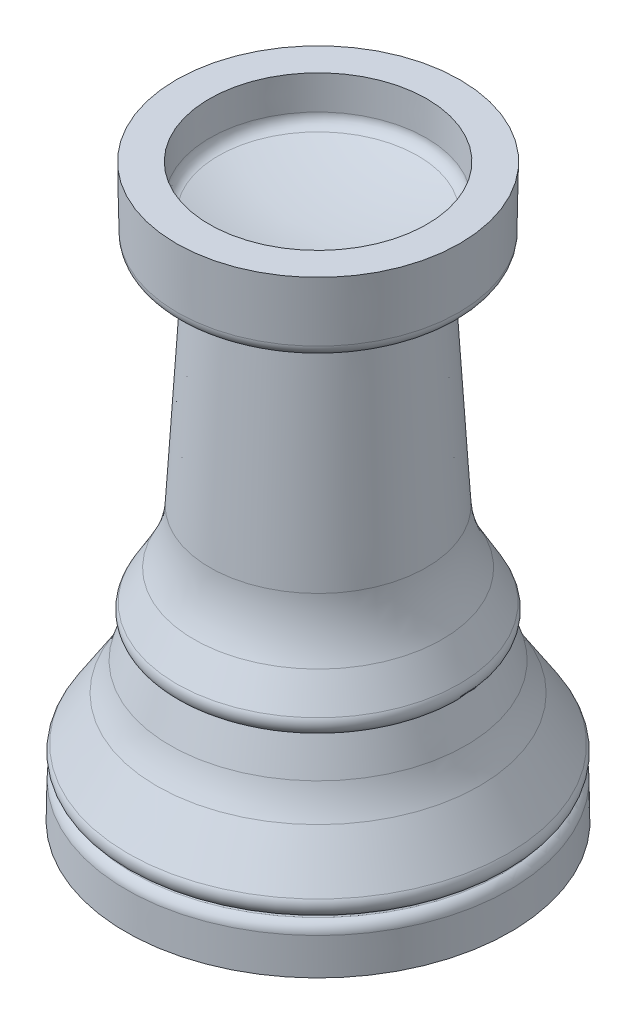
ISO-10303-21;
HEADER;
FILE_DESCRIPTION(('STEP AP214'),'2;1');
FILE_NAME('part.step','',(''),(''),'','','');
FILE_SCHEMA(('AUTOMOTIVE_DESIGN { 1 0 10303 214 1 1 1 1 }'));
ENDSEC;
DATA;
#1=APPLICATION_CONTEXT('core data for automotive mechanical design processes');
#2=APPLICATION_PROTOCOL_DEFINITION('international standard','automotive_design',2000,#1);
#3=PRODUCT_CONTEXT('',#1,'mechanical');
#4=PRODUCT('Part','Part','',(#3));
#5=PRODUCT_RELATED_PRODUCT_CATEGORY('part','',(#4));
#6=PRODUCT_DEFINITION_FORMATION('','',#4);
#7=PRODUCT_DEFINITION_CONTEXT('part definition',#1,'design');
#8=PRODUCT_DEFINITION('design','',#6,#7);
#9=PRODUCT_DEFINITION_SHAPE('','',#8);
#10=(LENGTH_UNIT() NAMED_UNIT(*) SI_UNIT(.MILLI.,.METRE.));
#11=(NAMED_UNIT(*) PLANE_ANGLE_UNIT() SI_UNIT($,.RADIAN.));
#12=(NAMED_UNIT(*) SI_UNIT($,.STERADIAN.) SOLID_ANGLE_UNIT());
#13=UNCERTAINTY_MEASURE_WITH_UNIT(LENGTH_MEASURE(1.E-05),#10,'distance_accuracy_value','');
#14=(GEOMETRIC_REPRESENTATION_CONTEXT(3) GLOBAL_UNCERTAINTY_ASSIGNED_CONTEXT((#13)) GLOBAL_UNIT_ASSIGNED_CONTEXT((#10,
#11,#12)) REPRESENTATION_CONTEXT('',''));
#15=CARTESIAN_POINT('',(0.,0.,0.));
#16=DIRECTION('',(0.,0.,1.));
#17=DIRECTION('',(1.,0.,0.));
#18=AXIS2_PLACEMENT_3D('',#15,#16,#17);
#19=CARTESIAN_POINT('',(119.157061,169.901604,0.));
#20=DIRECTION('',(0.,-1.,0.));
#21=DIRECTION('',(0.,0.,-1.));
#22=AXIS2_PLACEMENT_3D('',#19,#20,#21);
#23=TOROIDAL_SURFACE('',#22,8.00104199999999,1.00000051735934);
#24=CARTESIAN_POINT('',(119.157061,169.884151,0.));
#25=DIRECTION('',(0.,-1.,0.));
#26=DIRECTION('',(0.,0.,-1.));
#27=AXIS2_PLACEMENT_3D('',#24,#25,#26);
#28=CIRCLE('',#27,9.00089);
#29=CARTESIAN_POINT('',(119.157061,169.884151,-9.00089));
#30=VERTEX_POINT('',#29);
#31=EDGE_CURVE('E10',#30,#30,#28,.T.);
#32=ORIENTED_EDGE('',*,*,#31,.F.);
#33=EDGE_LOOP('',(#32));
#34=FACE_BOUND('',#33,.T.);
#35=CARTESIAN_POINT('',(119.157061,168.947626,0.));
#36=DIRECTION('',(0.,-1.,0.));
#37=DIRECTION('',(0.,0.,-1.));
#38=AXIS2_PLACEMENT_3D('',#35,#36,#37);
#39=CIRCLE('',#38,8.30092100000002);
#40=CARTESIAN_POINT('',(119.157061,168.947626,-8.30092100000002));
#41=VERTEX_POINT('',#40);
#42=EDGE_CURVE('E101',#41,#41,#39,.T.);
#43=ORIENTED_EDGE('',*,*,#42,.T.);
#44=EDGE_LOOP('',(#43));
#45=FACE_BOUND('',#44,.T.);
#46=ADVANCED_FACE('F28',(#34,#45),#23,.F.);
#47=CARTESIAN_POINT('',(119.157061,169.884151,0.));
#48=DIRECTION('',(0.,1.,0.));
#49=DIRECTION('',(0.,0.,1.));
#50=AXIS2_PLACEMENT_3D('',#47,#48,#49);
#51=CONICAL_SURFACE('',#50,9.00089,0.0174535102828913);
#52=CARTESIAN_POINT('',(119.157061,172.673679,0.));
#53=DIRECTION('',(0.,-1.,0.));
#54=DIRECTION('',(0.,0.,-1.));
#55=AXIS2_PLACEMENT_3D('',#52,#53,#54);
#56=CIRCLE('',#55,9.049582);
#57=CARTESIAN_POINT('',(119.157061,172.673679,-9.049582));
#58=VERTEX_POINT('',#57);
#59=EDGE_CURVE('E34',#58,#58,#56,.T.);
#60=ORIENTED_EDGE('',*,*,#59,.F.);
#61=EDGE_LOOP('',(#60));
#62=FACE_BOUND('',#61,.T.);
#63=ORIENTED_EDGE('',*,*,#31,.T.);
#64=EDGE_LOOP('',(#63));
#65=FACE_BOUND('',#64,.T.);
#66=ADVANCED_FACE('F117',(#62,#65),#51,.F.);
#67=CARTESIAN_POINT('',(107.357061,172.673679,0.));
#68=DIRECTION('',(0.,-1.,0.));
#69=DIRECTION('',(0.,0.,-1.));
#70=AXIS2_PLACEMENT_3D('',#67,#68,#69);
#71=PLANE('',#70);
#72=CARTESIAN_POINT('',(119.157061,172.673679,0.));
#73=DIRECTION('',(0.,-1.,0.));
#74=DIRECTION('',(0.,0.,-1.));
#75=AXIS2_PLACEMENT_3D('',#72,#73,#74);
#76=CIRCLE('',#75,11.8);
#77=CARTESIAN_POINT('',(119.157061,172.673679,-11.8));
#78=VERTEX_POINT('',#77);
#79=EDGE_CURVE('E38',#78,#78,#76,.T.);
#80=ORIENTED_EDGE('',*,*,#79,.F.);
#81=EDGE_LOOP('',(#80));
#82=FACE_BOUND('',#81,.T.);
#83=ORIENTED_EDGE('',*,*,#59,.T.);
#84=EDGE_LOOP('',(#83));
#85=FACE_BOUND('',#84,.T.);
#86=ADVANCED_FACE('F122',(#82,#85),#71,.F.);
#87=CARTESIAN_POINT('',(119.157061,172.673679,0.));
#88=DIRECTION('',(0.,1.,0.));
#89=DIRECTION('',(0.,0.,1.));
#90=AXIS2_PLACEMENT_3D('',#87,#88,#89);
#91=CONICAL_SURFACE('',#90,11.8,0.0174532306972353);
#92=CARTESIAN_POINT('',(119.157061,167.656225994025,0.));
#93=DIRECTION('',(0.,-1.,0.));
#94=DIRECTION('',(0.,0.,-1.));
#95=AXIS2_PLACEMENT_3D('',#92,#93,#94);
#96=CIRCLE('',#95,11.7124203422935);
#97=CARTESIAN_POINT('',(119.157061,167.656225994025,-11.7124203422935));
#98=VERTEX_POINT('',#97);
#99=EDGE_CURVE('E42',#98,#98,#96,.T.);
#100=ORIENTED_EDGE('',*,*,#99,.F.);
#101=EDGE_LOOP('',(#100));
#102=FACE_BOUND('',#101,.T.);
#103=ORIENTED_EDGE('',*,*,#79,.T.);
#104=EDGE_LOOP('',(#103));
#105=FACE_BOUND('',#104,.T.);
#106=ADVANCED_FACE('F127',(#102,#105),#91,.T.);
#107=CARTESIAN_POINT('',(119.157061,167.673679,0.));
#108=DIRECTION('',(0.,-1.,0.));
#109=DIRECTION('',(0.,0.,-1.));
#110=AXIS2_PLACEMENT_3D('',#107,#108,#109);
#111=TOROIDAL_SURFACE('',#110,10.712573,0.999999657654382);
#112=CARTESIAN_POINT('',(119.157061,166.673679,0.));
#113=DIRECTION('',(0.,-1.,0.));
#114=DIRECTION('',(0.,0.,-1.));
#115=AXIS2_PLACEMENT_3D('',#112,#113,#114);
#116=CIRCLE('',#115,10.712573);
#117=CARTESIAN_POINT('',(119.157061,166.673679,-10.712573));
#118=VERTEX_POINT('',#117);
#119=EDGE_CURVE('E47',#118,#118,#116,.T.);
#120=ORIENTED_EDGE('',*,*,#119,.F.);
#121=EDGE_LOOP('',(#120));
#122=FACE_BOUND('',#121,.T.);
#123=ORIENTED_EDGE('',*,*,#99,.T.);
#124=EDGE_LOOP('',(#123));
#125=FACE_BOUND('',#124,.T.);
#126=ADVANCED_FACE('F133',(#122,#125),#111,.T.);
#127=CARTESIAN_POINT('',(108.444488,166.673679,0.));
#128=DIRECTION('',(0.,1.,0.));
#129=DIRECTION('',(0.,0.,1.));
#130=AXIS2_PLACEMENT_3D('',#127,#128,#129);
#131=PLANE('',#130);
#132=CARTESIAN_POINT('',(119.157061,166.673679,0.));
#133=DIRECTION('',(0.,-1.,0.));
#134=DIRECTION('',(0.,0.,-1.));
#135=AXIS2_PLACEMENT_3D('',#132,#133,#134);
#136=CIRCLE('',#135,9.09999999999998);
#137=CARTESIAN_POINT('',(119.157061,166.673679,-9.09999999999998));
#138=VERTEX_POINT('',#137);
#139=EDGE_CURVE('E50',#138,#138,#136,.T.);
#140=ORIENTED_EDGE('',*,*,#139,.F.);
#141=EDGE_LOOP('',(#140));
#142=FACE_BOUND('',#141,.T.);
#143=ORIENTED_EDGE('',*,*,#119,.T.);
#144=EDGE_LOOP('',(#143));
#145=FACE_BOUND('',#144,.T.);
#146=ADVANCED_FACE('F137',(#142,#145),#131,.F.);
#147=CARTESIAN_POINT('',(119.157061,166.173679,0.));
#148=DIRECTION('',(0.,-1.,0.));
#149=DIRECTION('',(0.,0.,-1.));
#150=AXIS2_PLACEMENT_3D('',#147,#148,#149);
#151=TOROIDAL_SURFACE('',#150,9.09999999999998,0.5);
#152=CARTESIAN_POINT('',(119.157061,166.173679,0.));
#153=DIRECTION('',(0.,-1.,0.));
#154=DIRECTION('',(0.,0.,-1.));
#155=AXIS2_PLACEMENT_3D('',#152,#153,#154);
#156=CIRCLE('',#155,8.59999999999998);
#157=CARTESIAN_POINT('',(119.157061,166.173679,-8.59999999999998));
#158=VERTEX_POINT('',#157);
#159=EDGE_CURVE('E53',#158,#158,#156,.T.);
#160=ORIENTED_EDGE('',*,*,#159,.F.);
#161=EDGE_LOOP('',(#160));
#162=FACE_BOUND('',#161,.T.);
#163=ORIENTED_EDGE('',*,*,#139,.T.);
#164=EDGE_LOOP('',(#163));
#165=FACE_BOUND('',#164,.T.);
#166=ADVANCED_FACE('F141',(#162,#165),#151,.F.);
#167=CARTESIAN_POINT('',(119.157061,122.798679,0.));
#168=DIRECTION('',(0.,-1.,0.));
#169=DIRECTION('',(0.,0.,-1.));
#170=AXIS2_PLACEMENT_3D('',#167,#168,#169);
#171=CYLINDRICAL_SURFACE('',#170,8.59999999999998);
#172=CARTESIAN_POINT('',(119.157061,165.773679,0.));
#173=DIRECTION('',(0.,-1.,0.));
#174=DIRECTION('',(0.,0.,-1.));
#175=AXIS2_PLACEMENT_3D('',#172,#173,#174);
#176=CIRCLE('',#175,8.59999999999998);
#177=CARTESIAN_POINT('',(119.157061,165.773679,-8.59999999999998));
#178=VERTEX_POINT('',#177);
#179=EDGE_CURVE('E56',#178,#178,#176,.T.);
#180=ORIENTED_EDGE('',*,*,#179,.F.);
#181=EDGE_LOOP('',(#180));
#182=FACE_BOUND('',#181,.T.);
#183=ORIENTED_EDGE('',*,*,#159,.T.);
#184=EDGE_LOOP('',(#183));
#185=FACE_BOUND('',#184,.T.);
#186=ADVANCED_FACE('F145',(#182,#185),#171,.T.);
#187=CARTESIAN_POINT('',(119.157061,165.773679,0.));
#188=DIRECTION('',(0.,-1.,0.));
#189=DIRECTION('',(0.,0.,-1.));
#190=AXIS2_PLACEMENT_3D('',#187,#188,#189);
#191=TOROIDAL_SURFACE('',#190,7.99999999999999,0.599999999999989);
#192=CARTESIAN_POINT('',(119.157061,165.173679,0.));
#193=DIRECTION('',(0.,-1.,0.));
#194=DIRECTION('',(0.,0.,-1.));
#195=AXIS2_PLACEMENT_3D('',#192,#193,#194);
#196=CIRCLE('',#195,7.99999999999999);
#197=CARTESIAN_POINT('',(119.157061,165.173679,-7.99999999999999));
#198=VERTEX_POINT('',#197);
#199=EDGE_CURVE('E59',#198,#198,#196,.T.);
#200=ORIENTED_EDGE('',*,*,#199,.F.);
#201=EDGE_LOOP('',(#200));
#202=FACE_BOUND('',#201,.T.);
#203=ORIENTED_EDGE('',*,*,#179,.T.);
#204=EDGE_LOOP('',(#203));
#205=FACE_BOUND('',#204,.T.);
#206=ADVANCED_FACE('F149',(#202,#205),#191,.T.);
#207=CARTESIAN_POINT('',(119.157061,165.173679,0.));
#208=DIRECTION('',(0.,-1.,0.));
#209=DIRECTION('',(0.,0.,-1.));
#210=AXIS2_PLACEMENT_3D('',#207,#208,#209);
#211=CONICAL_SURFACE('',#210,7.99999999999999,0.0579287977524582);
#212=CARTESIAN_POINT('',(119.157061,147.923679001514,0.));
#213=DIRECTION('',(0.,-1.,0.));
#214=DIRECTION('',(0.,0.,-1.));
#215=AXIS2_PLACEMENT_3D('',#212,#213,#214);
#216=CIRCLE('',#215,9.00039103083482);
#217=CARTESIAN_POINT('',(119.157061,147.923679001514,-9.00039103083482));
#218=VERTEX_POINT('',#217);
#219=EDGE_CURVE('E62',#218,#218,#216,.T.);
#220=ORIENTED_EDGE('',*,*,#219,.F.);
#221=EDGE_LOOP('',(#220));
#222=FACE_BOUND('',#221,.T.);
#223=ORIENTED_EDGE('',*,*,#199,.T.);
#224=EDGE_LOOP('',(#223));
#225=FACE_BOUND('',#224,.T.);
#226=ADVANCED_FACE('F153',(#222,#225),#211,.T.);
#227=CARTESIAN_POINT('',(119.157061,148.414245,0.));
#228=DIRECTION('',(0.,-1.,0.));
#229=DIRECTION('',(0.,0.,-1.));
#230=AXIS2_PLACEMENT_3D('',#227,#228,#229);
#231=TOROIDAL_SURFACE('',#230,18.988351,9.99999996722579);
#232=CARTESIAN_POINT('',(119.157061,143.414245,0.));
#233=DIRECTION('',(0.,-1.,0.));
#234=DIRECTION('',(0.,0.,-1.));
#235=AXIS2_PLACEMENT_3D('',#232,#233,#234);
#236=CIRCLE('',#235,10.328097);
#237=CARTESIAN_POINT('',(119.157061,143.414245,-10.328097));
#238=VERTEX_POINT('',#237);
#239=EDGE_CURVE('E65',#238,#238,#236,.T.);
#240=ORIENTED_EDGE('',*,*,#239,.F.);
#241=EDGE_LOOP('',(#240));
#242=FACE_BOUND('',#241,.T.);
#243=ORIENTED_EDGE('',*,*,#219,.T.);
#244=EDGE_LOOP('',(#243));
#245=FACE_BOUND('',#244,.T.);
#246=ADVANCED_FACE('F157',(#242,#245),#231,.F.);
#247=CARTESIAN_POINT('',(119.157061,143.414245,0.));
#248=DIRECTION('',(0.,-1.,0.));
#249=DIRECTION('',(0.,0.,-1.));
#250=AXIS2_PLACEMENT_3D('',#247,#248,#249);
#251=CONICAL_SURFACE('',#250,10.328097,0.523598790494148);
#252=CARTESIAN_POINT('',(119.157061,140.923679,0.));
#253=DIRECTION('',(0.,-1.,0.));
#254=DIRECTION('',(0.,0.,-1.));
#255=AXIS2_PLACEMENT_3D('',#252,#253,#254);
#256=CIRCLE('',#255,11.766026);
#257=CARTESIAN_POINT('',(119.157061,140.923679,-11.766026));
#258=VERTEX_POINT('',#257);
#259=EDGE_CURVE('E68',#258,#258,#256,.T.);
#260=ORIENTED_EDGE('',*,*,#259,.F.);
#261=EDGE_LOOP('',(#260));
#262=FACE_BOUND('',#261,.T.);
#263=ORIENTED_EDGE('',*,*,#239,.T.);
#264=EDGE_LOOP('',(#263));
#265=FACE_BOUND('',#264,.T.);
#266=ADVANCED_FACE('F161',(#262,#265),#251,.T.);
#267=CARTESIAN_POINT('',(119.157061,140.423679,0.));
#268=DIRECTION('',(0.,-1.,0.));
#269=DIRECTION('',(0.,0.,-1.));
#270=AXIS2_PLACEMENT_3D('',#267,#268,#269);
#271=TOROIDAL_SURFACE('',#270,10.9,1.00000051633786);
#272=CARTESIAN_POINT('',(119.157061,139.557653,0.));
#273=DIRECTION('',(0.,-1.,0.));
#274=DIRECTION('',(0.,0.,-1.));
#275=AXIS2_PLACEMENT_3D('',#272,#273,#274);
#276=CIRCLE('',#275,11.4);
#277=CARTESIAN_POINT('',(119.157061,139.557653,-11.4));
#278=VERTEX_POINT('',#277);
#279=EDGE_CURVE('E71',#278,#278,#276,.T.);
#280=ORIENTED_EDGE('',*,*,#279,.F.);
#281=EDGE_LOOP('',(#280));
#282=FACE_BOUND('',#281,.T.);
#283=ORIENTED_EDGE('',*,*,#259,.T.);
#284=EDGE_LOOP('',(#283));
#285=FACE_BOUND('',#284,.T.);
#286=ADVANCED_FACE('F165',(#282,#285),#271,.T.);
#287=CARTESIAN_POINT('',(119.157061,139.557653,0.));
#288=DIRECTION('',(0.,-1.,0.));
#289=DIRECTION('',(0.,0.,-1.));
#290=AXIS2_PLACEMENT_3D('',#287,#288,#289);
#291=CONICAL_SURFACE('',#290,11.4,0.311374627497677);
#292=CARTESIAN_POINT('',(119.157061,136.756310005858,0.));
#293=DIRECTION('',(0.,-1.,0.));
#294=DIRECTION('',(0.,0.,-1.));
#295=AXIS2_PLACEMENT_3D('',#292,#293,#294);
#296=CIRCLE('',#295,12.3015950181999);
#297=CARTESIAN_POINT('',(119.157061,136.756310005858,-12.3015950181999));
#298=VERTEX_POINT('',#297);
#299=EDGE_CURVE('E74',#298,#298,#296,.T.);
#300=ORIENTED_EDGE('',*,*,#299,.F.);
#301=EDGE_LOOP('',(#300));
#302=FACE_BOUND('',#301,.T.);
#303=ORIENTED_EDGE('',*,*,#279,.T.);
#304=EDGE_LOOP('',(#303));
#305=FACE_BOUND('',#304,.T.);
#306=ADVANCED_FACE('F169',(#302,#305),#291,.T.);
#307=CARTESIAN_POINT('',(119.157061,139.819981,0.));
#308=DIRECTION('',(0.,-1.,0.));
#309=DIRECTION('',(0.,0.,-1.));
#310=AXIS2_PLACEMENT_3D('',#307,#308,#309);
#311=TOROIDAL_SURFACE('',#310,21.820729,9.99999958619054);
#312=CARTESIAN_POINT('',(119.157061,134.396969238102,0.));
#313=DIRECTION('',(0.,-1.,0.));
#314=DIRECTION('',(0.,0.,-1.));
#315=AXIS2_PLACEMENT_3D('',#312,#313,#314);
#316=CIRCLE('',#315,13.4188878463158);
#317=CARTESIAN_POINT('',(119.157061,134.396969238102,-13.4188878463158));
#318=VERTEX_POINT('',#317);
#319=EDGE_CURVE('E77',#318,#318,#316,.T.);
#320=ORIENTED_EDGE('',*,*,#319,.F.);
#321=EDGE_LOOP('',(#320));
#322=FACE_BOUND('',#321,.T.);
#323=ORIENTED_EDGE('',*,*,#299,.T.);
#324=EDGE_LOOP('',(#323));
#325=FACE_BOUND('',#324,.T.);
#326=ADVANCED_FACE('F173',(#322,#325),#311,.F.);
#327=CARTESIAN_POINT('',(119.157061,134.396969238102,0.));
#328=DIRECTION('',(0.,-1.,0.));
#329=DIRECTION('',(0.,0.,-1.));
#330=AXIS2_PLACEMENT_3D('',#327,#328,#329);
#331=CONICAL_SURFACE('',#330,13.4188878463158,0.573173663652216);
#332=CARTESIAN_POINT('',(119.157061,130.715980269847,0.));
#333=DIRECTION('',(0.,-1.,0.));
#334=DIRECTION('',(0.,0.,-1.));
#335=AXIS2_PLACEMENT_3D('',#332,#333,#334);
#336=CIRCLE('',#335,15.7948014180718);
#337=CARTESIAN_POINT('',(119.157061,130.715980269847,-15.7948014180718));
#338=VERTEX_POINT('',#337);
#339=EDGE_CURVE('E80',#338,#338,#336,.T.);
#340=ORIENTED_EDGE('',*,*,#339,.F.);
#341=EDGE_LOOP('',(#340));
#342=FACE_BOUND('',#341,.T.);
#343=ORIENTED_EDGE('',*,*,#319,.T.);
#344=EDGE_LOOP('',(#343));
#345=FACE_BOUND('',#344,.T.);
#346=ADVANCED_FACE('F177',(#342,#345),#331,.T.);
#347=CARTESIAN_POINT('',(119.157061,130.173679,0.));
#348=DIRECTION('',(0.,-1.,0.));
#349=DIRECTION('',(0.,0.,-1.));
#350=AXIS2_PLACEMENT_3D('',#347,#348,#349);
#351=TOROIDAL_SURFACE('',#350,14.954617,1.00000026182392);
#352=CARTESIAN_POINT('',(119.157061,129.263101503594,0.));
#353=DIRECTION('',(0.,-1.,0.));
#354=DIRECTION('',(0.,0.,-1.));
#355=AXIS2_PLACEMENT_3D('',#352,#353,#354);
#356=CIRCLE('',#355,15.3679572253337);
#357=CARTESIAN_POINT('',(119.157061,129.263101503594,-15.3679572253337));
#358=VERTEX_POINT('',#357);
#359=EDGE_CURVE('E83',#358,#358,#356,.T.);
#360=ORIENTED_EDGE('',*,*,#359,.F.);
#361=EDGE_LOOP('',(#360));
#362=FACE_BOUND('',#361,.T.);
#363=ORIENTED_EDGE('',*,*,#339,.T.);
#364=EDGE_LOOP('',(#363));
#365=FACE_BOUND('',#364,.T.);
#366=ADVANCED_FACE('F181',(#362,#365),#351,.T.);
#367=CARTESIAN_POINT('',(119.157061,129.172044,0.));
#368=DIRECTION('',(0.,-1.,0.));
#369=DIRECTION('',(0.,0.,-1.));
#370=AXIS2_PLACEMENT_3D('',#367,#368,#369);
#371=TOROIDAL_SURFACE('',#370,15.409291,0.0999997494446742);
#372=CARTESIAN_POINT('',(119.157061,129.081284165356,0.));
#373=DIRECTION('',(0.,-1.,0.));
#374=DIRECTION('',(0.,0.,-1.));
#375=AXIS2_PLACEMENT_3D('',#372,#373,#374);
#376=CIRCLE('',#375,15.3673080764877);
#377=CARTESIAN_POINT('',(119.157061,129.081284165356,-15.3673080764877));
#378=VERTEX_POINT('',#377);
#379=EDGE_CURVE('E86',#378,#378,#376,.T.);
#380=ORIENTED_EDGE('',*,*,#379,.F.);
#381=EDGE_LOOP('',(#380));
#382=FACE_BOUND('',#381,.T.);
#383=ORIENTED_EDGE('',*,*,#359,.T.);
#384=EDGE_LOOP('',(#383));
#385=FACE_BOUND('',#384,.T.);
#386=ADVANCED_FACE('F185',(#382,#385),#371,.F.);
#387=CARTESIAN_POINT('',(119.157061,128.173679,0.));
#388=DIRECTION('',(0.,-1.,0.));
#389=DIRECTION('',(0.,0.,-1.));
#390=AXIS2_PLACEMENT_3D('',#387,#388,#389);
#391=TOROIDAL_SURFACE('',#390,14.947483,1.00000011551449);
#392=CARTESIAN_POINT('',(119.157061,128.191131,0.));
#393=DIRECTION('',(0.,-1.,0.));
#394=DIRECTION('',(0.,0.,-1.));
#395=AXIS2_PLACEMENT_3D('',#392,#393,#394);
#396=CIRCLE('',#395,15.947331);
#397=CARTESIAN_POINT('',(119.157061,128.191131,-15.947331));
#398=VERTEX_POINT('',#397);
#399=EDGE_CURVE('E89',#398,#398,#396,.T.);
#400=ORIENTED_EDGE('',*,*,#399,.F.);
#401=EDGE_LOOP('',(#400));
#402=FACE_BOUND('',#401,.T.);
#403=ORIENTED_EDGE('',*,*,#379,.T.);
#404=EDGE_LOOP('',(#403));
#405=FACE_BOUND('',#404,.T.);
#406=ADVANCED_FACE('F189',(#402,#405),#391,.T.);
#407=CARTESIAN_POINT('',(119.157061,128.191131,0.));
#408=DIRECTION('',(0.,-1.,0.));
#409=DIRECTION('',(0.,0.,-1.));
#410=AXIS2_PLACEMENT_3D('',#407,#408,#409);
#411=CONICAL_SURFACE('',#410,15.947331,0.017453020658836);
#412=CARTESIAN_POINT('',(119.157061,125.173679,0.));
#413=DIRECTION('',(0.,-1.,0.));
#414=DIRECTION('',(0.,0.,-1.));
#415=AXIS2_PLACEMENT_3D('',#412,#413,#414);
#416=CIRCLE('',#415,16.);
#417=CARTESIAN_POINT('',(119.157061,125.173679,-16.));
#418=VERTEX_POINT('',#417);
#419=EDGE_CURVE('E92',#418,#418,#416,.T.);
#420=ORIENTED_EDGE('',*,*,#419,.F.);
#421=EDGE_LOOP('',(#420));
#422=FACE_BOUND('',#421,.T.);
#423=ORIENTED_EDGE('',*,*,#399,.T.);
#424=EDGE_LOOP('',(#423));
#425=FACE_BOUND('',#424,.T.);
#426=ADVANCED_FACE('F193',(#422,#425),#411,.T.);
#427=CARTESIAN_POINT('',(103.157061,125.173679,0.));
#428=DIRECTION('',(0.,1.,0.));
#429=DIRECTION('',(0.,0.,1.));
#430=AXIS2_PLACEMENT_3D('',#427,#428,#429);
#431=PLANE('',#430);
#432=CARTESIAN_POINT('',(119.157061,125.173679,0.));
#433=DIRECTION('',(0.,-1.,0.));
#434=DIRECTION('',(0.,0.,-1.));
#435=AXIS2_PLACEMENT_3D('',#432,#433,#434);
#436=CIRCLE('',#435,6.99999999999999);
#437=CARTESIAN_POINT('',(119.157061,125.173679,-6.99999999999999));
#438=VERTEX_POINT('',#437);
#439=EDGE_CURVE('E95',#438,#438,#436,.T.);
#440=ORIENTED_EDGE('',*,*,#439,.F.);
#441=EDGE_LOOP('',(#440));
#442=FACE_BOUND('',#441,.T.);
#443=ORIENTED_EDGE('',*,*,#419,.T.);
#444=EDGE_LOOP('',(#443));
#445=FACE_BOUND('',#444,.T.);
#446=ADVANCED_FACE('F197',(#442,#445),#431,.F.);
#447=CARTESIAN_POINT('',(119.157061,125.173679,0.));
#448=DIRECTION('',(0.,-1.,0.));
#449=DIRECTION('',(0.,0.,-1.));
#450=AXIS2_PLACEMENT_3D('',#447,#448,#449);
#451=CONICAL_SURFACE('',#450,6.99999999999999,0.0698131778399845);
#452=CARTESIAN_POINT('',(119.157061,159.911232952902,0.));
#453=DIRECTION('',(0.,-1.,0.));
#454=DIRECTION('',(0.,0.,-1.));
#455=AXIS2_PLACEMENT_3D('',#452,#453,#454);
#456=CIRCLE('',#455,4.57091332646896);
#457=CARTESIAN_POINT('',(119.157061,159.911232952902,-4.57091332646896));
#458=VERTEX_POINT('',#457);
#459=EDGE_CURVE('E98',#458,#458,#456,.T.);
#460=ORIENTED_EDGE('',*,*,#459,.F.);
#461=EDGE_LOOP('',(#460));
#462=FACE_BOUND('',#461,.T.);
#463=ORIENTED_EDGE('',*,*,#439,.T.);
#464=EDGE_LOOP('',(#463));
#465=FACE_BOUND('',#464,.T.);
#466=ADVANCED_FACE('F113',(#462,#465),#451,.F.);
#467=CARTESIAN_POINT('',(119.157061,159.591604,0.));
#468=DIRECTION('',(0.,-1.,0.));
#469=DIRECTION('',(-1.,0.,0.));
#470=AXIS2_PLACEMENT_3D('',#467,#468,#469);
#471=SPHERICAL_SURFACE('',#470,4.58207499999999);
#472=ORIENTED_EDGE('',*,*,#459,.T.);
#473=EDGE_LOOP('',(#472));
#474=FACE_BOUND('',#473,.T.);
#475=ADVANCED_FACE('F108',(#474),#471,.F.);
#476=CARTESIAN_POINT('',(119.157061,195.354653,0.));
#477=DIRECTION('',(0.,-1.,0.));
#478=DIRECTION('',(1.,0.,0.));
#479=AXIS2_PLACEMENT_3D('',#476,#477,#478);
#480=SPHERICAL_SURFACE('',#479,27.6809747737859);
#481=ORIENTED_EDGE('',*,*,#42,.F.);
#482=EDGE_LOOP('',(#481));
#483=FACE_BOUND('',#482,.T.);
#484=ADVANCED_FACE('F106',(#483),#480,.F.);
#485=CLOSED_SHELL('',(#46,#66,#86,#106,#126,#146,#166,#186,#206,#226,#246,#266,#286,#306,#326,
#346,#366,#386,#406,#426,#446,#466,#475,#484));
#486=MANIFOLD_SOLID_BREP('B2',#485);
#487=ADVANCED_BREP_SHAPE_REPRESENTATION('',(#18,#486),#14);
#488=SHAPE_DEFINITION_REPRESENTATION(#9,#487);
ENDSEC;
END-ISO-10303-21;
